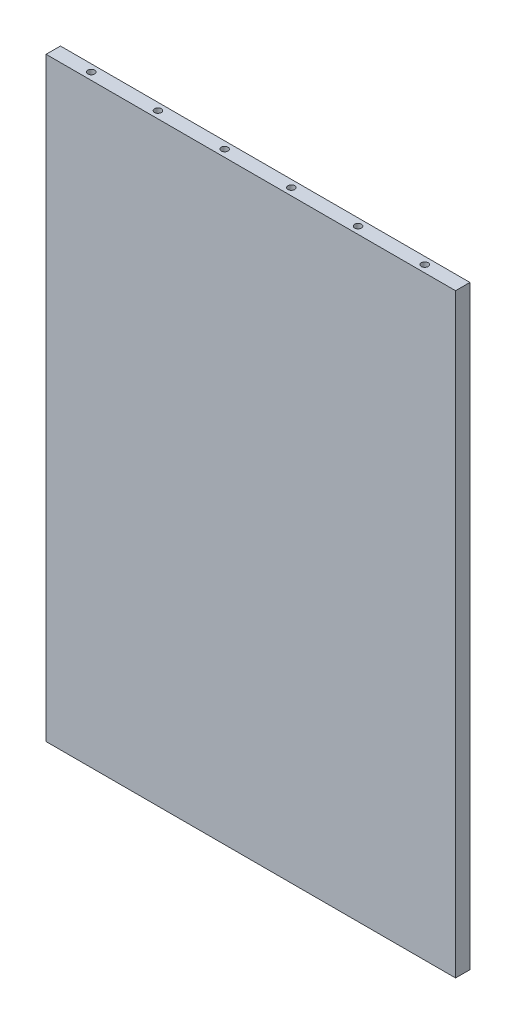
ISO-10303-21;
HEADER;
FILE_DESCRIPTION(('STEP AP214'),'2;1');
FILE_NAME('part.step','',(''),(''),'','','');
FILE_SCHEMA(('AUTOMOTIVE_DESIGN { 1 0 10303 214 1 1 1 1 }'));
ENDSEC;
DATA;
#1=APPLICATION_CONTEXT('core data for automotive mechanical design processes');
#2=APPLICATION_PROTOCOL_DEFINITION('international standard','automotive_design',2000,#1);
#3=PRODUCT_CONTEXT('',#1,'mechanical');
#4=PRODUCT('Part','Part','',(#3));
#5=PRODUCT_RELATED_PRODUCT_CATEGORY('part','',(#4));
#6=PRODUCT_DEFINITION_FORMATION('','',#4);
#7=PRODUCT_DEFINITION_CONTEXT('part definition',#1,'design');
#8=PRODUCT_DEFINITION('design','',#6,#7);
#9=PRODUCT_DEFINITION_SHAPE('','',#8);
#10=(LENGTH_UNIT() NAMED_UNIT(*) SI_UNIT(.MILLI.,.METRE.));
#11=(NAMED_UNIT(*) PLANE_ANGLE_UNIT() SI_UNIT($,.RADIAN.));
#12=(NAMED_UNIT(*) SI_UNIT($,.STERADIAN.) SOLID_ANGLE_UNIT());
#13=UNCERTAINTY_MEASURE_WITH_UNIT(LENGTH_MEASURE(1.E-05),#10,'distance_accuracy_value','');
#14=(GEOMETRIC_REPRESENTATION_CONTEXT(3) GLOBAL_UNCERTAINTY_ASSIGNED_CONTEXT((#13)) GLOBAL_UNIT_ASSIGNED_CONTEXT((#10,
#11,#12)) REPRESENTATION_CONTEXT('',''));
#15=CARTESIAN_POINT('',(0.,0.,0.));
#16=DIRECTION('',(0.,0.,1.));
#17=DIRECTION('',(1.,0.,0.));
#18=AXIS2_PLACEMENT_3D('',#15,#16,#17);
#19=CARTESIAN_POINT('',(255.,-733.,-17.));
#20=DIRECTION('',(0.,-1.,0.));
#21=DIRECTION('',(1.,0.,0.));
#22=AXIS2_PLACEMENT_3D('',#19,#20,#21);
#23=PLANE('',#22);
#24=CARTESIAN_POINT('',(-106.,-733.,-8.50000000000001));
#25=DIRECTION('',(0.,-1.,0.));
#26=DIRECTION('',(1.,0.,0.));
#27=AXIS2_PLACEMENT_3D('',#24,#25,#26);
#28=CIRCLE('',#27,3.99999999999999);
#29=CARTESIAN_POINT('',(-102.,-733.,-8.50000000000001));
#30=VERTEX_POINT('',#29);
#31=EDGE_CURVE('E178',#30,#30,#28,.F.);
#32=ORIENTED_EDGE('',*,*,#31,.T.);
#33=EDGE_LOOP('',(#32));
#34=FACE_BOUND('',#33,.T.);
#35=CARTESIAN_POINT('',(52.,-733.,-8.50000000000001));
#36=DIRECTION('',(0.,-1.,0.));
#37=DIRECTION('',(1.,0.,0.));
#38=AXIS2_PLACEMENT_3D('',#35,#36,#37);
#39=CIRCLE('',#38,3.99999999999999);
#40=CARTESIAN_POINT('',(56.,-733.,-8.50000000000001));
#41=VERTEX_POINT('',#40);
#42=EDGE_CURVE('E171',#41,#41,#39,.F.);
#43=ORIENTED_EDGE('',*,*,#42,.T.);
#44=EDGE_LOOP('',(#43));
#45=FACE_BOUND('',#44,.T.);
#46=CARTESIAN_POINT('',(210.,-733.,-8.50000000000004));
#47=DIRECTION('',(0.,-1.,0.));
#48=DIRECTION('',(1.,0.,0.));
#49=AXIS2_PLACEMENT_3D('',#46,#47,#48);
#50=CIRCLE('',#49,3.99999999999999);
#51=CARTESIAN_POINT('',(214.,-733.,-8.50000000000004));
#52=VERTEX_POINT('',#51);
#53=EDGE_CURVE('E162',#52,#52,#50,.F.);
#54=ORIENTED_EDGE('',*,*,#53,.T.);
#55=EDGE_LOOP('',(#54));
#56=FACE_BOUND('',#55,.T.);
#57=DIRECTION('',(1.,0.,0.));
#58=VECTOR('',#57,1.);
#59=CARTESIAN_POINT('',(255.,-733.,0.));
#60=LINE('',#59,#58);
#61=CARTESIAN_POINT('',(-230.,-733.,0.));
#62=VERTEX_POINT('',#61);
#63=CARTESIAN_POINT('',(255.,-733.,0.));
#64=VERTEX_POINT('',#63);
#65=EDGE_CURVE('E98',#62,#64,#60,.T.);
#66=ORIENTED_EDGE('',*,*,#65,.F.);
#67=DIRECTION('',(0.,0.,1.));
#68=VECTOR('',#67,1.);
#69=CARTESIAN_POINT('',(-230.,-733.,-17.));
#70=LINE('',#69,#68);
#71=CARTESIAN_POINT('',(-230.,-733.,-17.));
#72=VERTEX_POINT('',#71);
#73=EDGE_CURVE('E43',#72,#62,#70,.T.);
#74=ORIENTED_EDGE('',*,*,#73,.F.);
#75=DIRECTION('',(1.,0.,0.));
#76=VECTOR('',#75,1.);
#77=CARTESIAN_POINT('',(255.,-733.,-17.));
#78=LINE('',#77,#76);
#79=CARTESIAN_POINT('',(255.,-733.,-17.));
#80=VERTEX_POINT('',#79);
#81=EDGE_CURVE('E92',#72,#80,#78,.T.);
#82=ORIENTED_EDGE('',*,*,#81,.T.);
#83=DIRECTION('',(0.,0.,1.));
#84=VECTOR('',#83,1.);
#85=CARTESIAN_POINT('',(255.,-733.,-17.));
#86=LINE('',#85,#84);
#87=EDGE_CURVE('E11',#80,#64,#86,.T.);
#88=ORIENTED_EDGE('',*,*,#87,.T.);
#89=EDGE_LOOP('',(#66,#74,#82,#88));
#90=FACE_BOUND('',#89,.T.);
#91=CARTESIAN_POINT('',(131.,-733.,-8.50000000000004));
#92=DIRECTION('',(0.,-1.,0.));
#93=DIRECTION('',(1.,0.,0.));
#94=AXIS2_PLACEMENT_3D('',#91,#92,#93);
#95=CIRCLE('',#94,3.99999999999999);
#96=CARTESIAN_POINT('',(135.,-733.,-8.50000000000004));
#97=VERTEX_POINT('',#96);
#98=EDGE_CURVE('E167',#97,#97,#95,.F.);
#99=ORIENTED_EDGE('',*,*,#98,.T.);
#100=EDGE_LOOP('',(#99));
#101=FACE_BOUND('',#100,.T.);
#102=CARTESIAN_POINT('',(-27.,-733.,-8.50000000000001));
#103=DIRECTION('',(0.,-1.,0.));
#104=DIRECTION('',(1.,0.,0.));
#105=AXIS2_PLACEMENT_3D('',#102,#103,#104);
#106=CIRCLE('',#105,3.99999999999999);
#107=CARTESIAN_POINT('',(-23.,-733.,-8.50000000000001));
#108=VERTEX_POINT('',#107);
#109=EDGE_CURVE('E175',#108,#108,#106,.F.);
#110=ORIENTED_EDGE('',*,*,#109,.T.);
#111=EDGE_LOOP('',(#110));
#112=FACE_BOUND('',#111,.T.);
#113=CARTESIAN_POINT('',(-185.,-733.,-8.49999999999998));
#114=DIRECTION('',(0.,-1.,0.));
#115=DIRECTION('',(1.,0.,0.));
#116=AXIS2_PLACEMENT_3D('',#113,#114,#115);
#117=CIRCLE('',#116,3.99999999999999);
#118=CARTESIAN_POINT('',(-181.,-733.,-8.49999999999998));
#119=VERTEX_POINT('',#118);
#120=EDGE_CURVE('E37',#119,#119,#117,.F.);
#121=ORIENTED_EDGE('',*,*,#120,.T.);
#122=EDGE_LOOP('',(#121));
#123=FACE_BOUND('',#122,.T.);
#124=ADVANCED_FACE('F33',(#34,#45,#56,#90,#101,#112,#123),#23,.T.);
#125=CARTESIAN_POINT('',(0.,0.,-17.));
#126=DIRECTION('',(0.,0.,-1.));
#127=DIRECTION('',(-1.,0.,0.));
#128=AXIS2_PLACEMENT_3D('',#125,#126,#127);
#129=PLANE('',#128);
#130=CARTESIAN_POINT('',(127.,-92.5000000000001,-17.));
#131=DIRECTION('',(0.,0.,-1.));
#132=DIRECTION('',(-1.,0.,0.));
#133=AXIS2_PLACEMENT_3D('',#130,#131,#132);
#134=CIRCLE('',#133,2.49999999999985);
#135=CARTESIAN_POINT('',(124.5,-92.5000000000001,-17.));
#136=VERTEX_POINT('',#135);
#137=EDGE_CURVE('E802',#136,#136,#134,.T.);
#138=ORIENTED_EDGE('',*,*,#137,.F.);
#139=EDGE_LOOP('',(#138));
#140=FACE_BOUND('',#139,.T.);
#141=CARTESIAN_POINT('',(-193.,-92.5000000000001,-17.));
#142=DIRECTION('',(0.,0.,-1.));
#143=DIRECTION('',(-1.,0.,0.));
#144=AXIS2_PLACEMENT_3D('',#141,#142,#143);
#145=CIRCLE('',#144,2.50000000000029);
#146=CARTESIAN_POINT('',(-195.5,-92.5000000000001,-17.));
#147=VERTEX_POINT('',#146);
#148=EDGE_CURVE('E801',#147,#147,#145,.T.);
#149=ORIENTED_EDGE('',*,*,#148,.F.);
#150=EDGE_LOOP('',(#149));
#151=FACE_BOUND('',#150,.T.);
#152=CARTESIAN_POINT('',(127.,-610.,-17.));
#153=DIRECTION('',(0.,0.,-1.));
#154=DIRECTION('',(-1.,0.,0.));
#155=AXIS2_PLACEMENT_3D('',#152,#153,#154);
#156=CIRCLE('',#155,2.5);
#157=CARTESIAN_POINT('',(124.5,-610.,-17.));
#158=VERTEX_POINT('',#157);
#159=EDGE_CURVE('E165',#158,#158,#156,.T.);
#160=ORIENTED_EDGE('',*,*,#159,.F.);
#161=EDGE_LOOP('',(#160));
#162=FACE_BOUND('',#161,.T.);
#163=CARTESIAN_POINT('',(-193.,-610.,-17.));
#164=DIRECTION('',(0.,0.,-1.));
#165=DIRECTION('',(-1.,0.,0.));
#166=AXIS2_PLACEMENT_3D('',#163,#164,#165);
#167=CIRCLE('',#166,2.50000000000032);
#168=CARTESIAN_POINT('',(-195.5,-610.,-17.));
#169=VERTEX_POINT('',#168);
#170=EDGE_CURVE('E203',#169,#169,#167,.T.);
#171=ORIENTED_EDGE('',*,*,#170,.F.);
#172=EDGE_LOOP('',(#171));
#173=FACE_BOUND('',#172,.T.);
#174=CARTESIAN_POINT('',(245.5,-551.,-17.));
#175=DIRECTION('',(0.,0.,-1.));
#176=DIRECTION('',(-1.,0.,0.));
#177=AXIS2_PLACEMENT_3D('',#174,#175,#176);
#178=CIRCLE('',#177,3.99999999999999);
#179=CARTESIAN_POINT('',(241.5,-551.,-17.));
#180=VERTEX_POINT('',#179);
#181=EDGE_CURVE('E154',#180,#180,#178,.F.);
#182=ORIENTED_EDGE('',*,*,#181,.T.);
#183=EDGE_LOOP('',(#182));
#184=FACE_BOUND('',#183,.T.);
#185=CARTESIAN_POINT('',(245.5,-200.,-17.));
#186=DIRECTION('',(0.,0.,-1.));
#187=DIRECTION('',(-1.,0.,0.));
#188=AXIS2_PLACEMENT_3D('',#185,#186,#187);
#189=CIRCLE('',#188,3.99999999999999);
#190=CARTESIAN_POINT('',(241.5,-200.,-17.));
#191=VERTEX_POINT('',#190);
#192=EDGE_CURVE('E146',#191,#191,#189,.F.);
#193=ORIENTED_EDGE('',*,*,#192,.T.);
#194=EDGE_LOOP('',(#193));
#195=FACE_BOUND('',#194,.T.);
#196=CARTESIAN_POINT('',(245.5,-83.,-17.));
#197=DIRECTION('',(0.,0.,-1.));
#198=DIRECTION('',(-1.,0.,0.));
#199=AXIS2_PLACEMENT_3D('',#196,#197,#198);
#200=CIRCLE('',#199,3.99999999999999);
#201=CARTESIAN_POINT('',(241.5,-83.,-17.));
#202=VERTEX_POINT('',#201);
#203=EDGE_CURVE('E137',#202,#202,#200,.F.);
#204=ORIENTED_EDGE('',*,*,#203,.T.);
#205=EDGE_LOOP('',(#204));
#206=FACE_BOUND('',#205,.T.);
#207=CARTESIAN_POINT('',(127.,-262.,-17.));
#208=DIRECTION('',(0.,0.,-1.));
#209=DIRECTION('',(-1.,0.,0.));
#210=AXIS2_PLACEMENT_3D('',#207,#208,#209);
#211=CIRCLE('',#210,2.49999999999985);
#212=CARTESIAN_POINT('',(124.5,-262.,-17.));
#213=VERTEX_POINT('',#212);
#214=EDGE_CURVE('E140',#213,#213,#211,.T.);
#215=ORIENTED_EDGE('',*,*,#214,.F.);
#216=EDGE_LOOP('',(#215));
#217=FACE_BOUND('',#216,.T.);
#218=CARTESIAN_POINT('',(-193.,-262.,-17.));
#219=DIRECTION('',(0.,0.,-1.));
#220=DIRECTION('',(-1.,0.,0.));
#221=AXIS2_PLACEMENT_3D('',#218,#219,#220);
#222=CIRCLE('',#221,2.49999999999985);
#223=CARTESIAN_POINT('',(-195.5,-262.,-17.));
#224=VERTEX_POINT('',#223);
#225=EDGE_CURVE('E226',#224,#224,#222,.T.);
#226=ORIENTED_EDGE('',*,*,#225,.F.);
#227=EDGE_LOOP('',(#226));
#228=FACE_BOUND('',#227,.T.);
#229=CARTESIAN_POINT('',(127.,-441.5,-17.));
#230=DIRECTION('',(0.,0.,-1.));
#231=DIRECTION('',(-1.,0.,0.));
#232=AXIS2_PLACEMENT_3D('',#229,#230,#231);
#233=CIRCLE('',#232,2.49999999999985);
#234=CARTESIAN_POINT('',(124.5,-441.5,-17.));
#235=VERTEX_POINT('',#234);
#236=EDGE_CURVE('E232',#235,#235,#233,.T.);
#237=ORIENTED_EDGE('',*,*,#236,.F.);
#238=EDGE_LOOP('',(#237));
#239=FACE_BOUND('',#238,.T.);
#240=CARTESIAN_POINT('',(-193.,-441.5,-17.));
#241=DIRECTION('',(0.,0.,-1.));
#242=DIRECTION('',(-1.,0.,0.));
#243=AXIS2_PLACEMENT_3D('',#240,#241,#242);
#244=CIRCLE('',#243,2.49999999999985);
#245=CARTESIAN_POINT('',(-195.5,-441.5,-17.));
#246=VERTEX_POINT('',#245);
#247=EDGE_CURVE('E238',#246,#246,#244,.T.);
#248=ORIENTED_EDGE('',*,*,#247,.F.);
#249=EDGE_LOOP('',(#248));
#250=FACE_BOUND('',#249,.T.);
#251=DIRECTION('',(0.,1.,0.));
#252=VECTOR('',#251,1.);
#253=CARTESIAN_POINT('',(255.,-28.,-17.));
#254=LINE('',#253,#252);
#255=CARTESIAN_POINT('',(255.,-28.,-17.));
#256=VERTEX_POINT('',#255);
#257=EDGE_CURVE('E96',#80,#256,#254,.T.);
#258=ORIENTED_EDGE('',*,*,#257,.F.);
#259=ORIENTED_EDGE('',*,*,#81,.F.);
#260=DIRECTION('',(0.,-1.,0.));
#261=VECTOR('',#260,1.);
#262=CARTESIAN_POINT('',(-230.,-28.0000000000001,-17.));
#263=LINE('',#262,#261);
#264=CARTESIAN_POINT('',(-230.,-28.0000000000001,-17.));
#265=VERTEX_POINT('',#264);
#266=EDGE_CURVE('E83',#265,#72,#263,.T.);
#267=ORIENTED_EDGE('',*,*,#266,.F.);
#268=DIRECTION('',(-1.,0.,0.));
#269=VECTOR('',#268,1.);
#270=CARTESIAN_POINT('',(255.,-28.,-17.));
#271=LINE('',#270,#269);
#272=EDGE_CURVE('E91',#256,#265,#271,.T.);
#273=ORIENTED_EDGE('',*,*,#272,.F.);
#274=EDGE_LOOP('',(#258,#259,#267,#273));
#275=FACE_BOUND('',#274,.T.);
#276=CARTESIAN_POINT('',(245.5,-317.,-17.));
#277=DIRECTION('',(0.,0.,-1.));
#278=DIRECTION('',(-1.,0.,0.));
#279=AXIS2_PLACEMENT_3D('',#276,#277,#278);
#280=CIRCLE('',#279,3.99999999999999);
#281=CARTESIAN_POINT('',(241.5,-317.,-17.));
#282=VERTEX_POINT('',#281);
#283=EDGE_CURVE('E142',#282,#282,#280,.F.);
#284=ORIENTED_EDGE('',*,*,#283,.T.);
#285=EDGE_LOOP('',(#284));
#286=FACE_BOUND('',#285,.T.);
#287=CARTESIAN_POINT('',(245.5,-434.,-17.));
#288=DIRECTION('',(0.,0.,-1.));
#289=DIRECTION('',(-1.,0.,0.));
#290=AXIS2_PLACEMENT_3D('',#287,#288,#289);
#291=CIRCLE('',#290,3.99999999999999);
#292=CARTESIAN_POINT('',(241.5,-434.,-17.));
#293=VERTEX_POINT('',#292);
#294=EDGE_CURVE('E150',#293,#293,#291,.F.);
#295=ORIENTED_EDGE('',*,*,#294,.T.);
#296=EDGE_LOOP('',(#295));
#297=FACE_BOUND('',#296,.T.);
#298=CARTESIAN_POINT('',(245.5,-668.,-17.));
#299=DIRECTION('',(0.,0.,-1.));
#300=DIRECTION('',(-1.,0.,0.));
#301=AXIS2_PLACEMENT_3D('',#298,#299,#300);
#302=CIRCLE('',#301,3.99999999999999);
#303=CARTESIAN_POINT('',(241.5,-668.,-17.));
#304=VERTEX_POINT('',#303);
#305=EDGE_CURVE('E158',#304,#304,#302,.F.);
#306=ORIENTED_EDGE('',*,*,#305,.T.);
#307=EDGE_LOOP('',(#306));
#308=FACE_BOUND('',#307,.T.);
#309=ADVANCED_FACE('F89',(#140,#151,#162,#173,#184,#195,#206,#217,#228,#239,#250,#275,#286,#297,
#308),#129,.T.);
#310=CARTESIAN_POINT('',(255.,-28.,-17.));
#311=DIRECTION('',(0.,1.,0.));
#312=DIRECTION('',(-1.,0.,0.));
#313=AXIS2_PLACEMENT_3D('',#310,#311,#312);
#314=PLANE('',#313);
#315=CARTESIAN_POINT('',(-106.,-28.,-8.50000000000001));
#316=DIRECTION('',(0.,1.,0.));
#317=DIRECTION('',(-1.,0.,0.));
#318=AXIS2_PLACEMENT_3D('',#315,#316,#317);
#319=CIRCLE('',#318,3.99999999999999);
#320=CARTESIAN_POINT('',(-110.,-28.,-8.50000000000001));
#321=VERTEX_POINT('',#320);
#322=EDGE_CURVE('E129',#321,#321,#319,.F.);
#323=ORIENTED_EDGE('',*,*,#322,.T.);
#324=EDGE_LOOP('',(#323));
#325=FACE_BOUND('',#324,.T.);
#326=CARTESIAN_POINT('',(52.,-28.,-8.50000000000001));
#327=DIRECTION('',(0.,1.,0.));
#328=DIRECTION('',(-1.,0.,0.));
#329=AXIS2_PLACEMENT_3D('',#326,#327,#328);
#330=CIRCLE('',#329,3.99999999999999);
#331=CARTESIAN_POINT('',(48.,-28.,-8.50000000000001));
#332=VERTEX_POINT('',#331);
#333=EDGE_CURVE('E121',#332,#332,#330,.F.);
#334=ORIENTED_EDGE('',*,*,#333,.T.);
#335=EDGE_LOOP('',(#334));
#336=FACE_BOUND('',#335,.T.);
#337=CARTESIAN_POINT('',(210.,-28.,-8.50000000000001));
#338=DIRECTION('',(0.,1.,0.));
#339=DIRECTION('',(-1.,0.,0.));
#340=AXIS2_PLACEMENT_3D('',#337,#338,#339);
#341=CIRCLE('',#340,3.99999999999999);
#342=CARTESIAN_POINT('',(206.,-28.,-8.50000000000001));
#343=VERTEX_POINT('',#342);
#344=EDGE_CURVE('E107',#343,#343,#341,.F.);
#345=ORIENTED_EDGE('',*,*,#344,.T.);
#346=EDGE_LOOP('',(#345));
#347=FACE_BOUND('',#346,.T.);
#348=DIRECTION('',(-1.,0.,0.));
#349=VECTOR('',#348,1.);
#350=CARTESIAN_POINT('',(255.,-28.,0.));
#351=LINE('',#350,#349);
#352=CARTESIAN_POINT('',(255.,-28.,0.));
#353=VERTEX_POINT('',#352);
#354=CARTESIAN_POINT('',(-230.,-28.0000000000001,0.));
#355=VERTEX_POINT('',#354);
#356=EDGE_CURVE('E106',#353,#355,#351,.T.);
#357=ORIENTED_EDGE('',*,*,#356,.F.);
#358=DIRECTION('',(0.,0.,1.));
#359=VECTOR('',#358,1.);
#360=CARTESIAN_POINT('',(255.,-28.,-17.));
#361=LINE('',#360,#359);
#362=EDGE_CURVE('E77',#256,#353,#361,.T.);
#363=ORIENTED_EDGE('',*,*,#362,.F.);
#364=ORIENTED_EDGE('',*,*,#272,.T.);
#365=DIRECTION('',(0.,0.,1.));
#366=VECTOR('',#365,1.);
#367=CARTESIAN_POINT('',(-230.,-28.0000000000001,-17.));
#368=LINE('',#367,#366);
#369=EDGE_CURVE('E80',#265,#355,#368,.T.);
#370=ORIENTED_EDGE('',*,*,#369,.T.);
#371=EDGE_LOOP('',(#357,#363,#364,#370));
#372=FACE_BOUND('',#371,.T.);
#373=CARTESIAN_POINT('',(131.,-28.,-8.50000000000001));
#374=DIRECTION('',(0.,1.,0.));
#375=DIRECTION('',(-1.,0.,0.));
#376=AXIS2_PLACEMENT_3D('',#373,#374,#375);
#377=CIRCLE('',#376,3.99999999999999);
#378=CARTESIAN_POINT('',(127.,-28.,-8.50000000000001));
#379=VERTEX_POINT('',#378);
#380=EDGE_CURVE('E117',#379,#379,#377,.F.);
#381=ORIENTED_EDGE('',*,*,#380,.T.);
#382=EDGE_LOOP('',(#381));
#383=FACE_BOUND('',#382,.T.);
#384=CARTESIAN_POINT('',(-27.,-28.,-8.50000000000001));
#385=DIRECTION('',(0.,1.,0.));
#386=DIRECTION('',(-1.,0.,0.));
#387=AXIS2_PLACEMENT_3D('',#384,#385,#386);
#388=CIRCLE('',#387,3.99999999999999);
#389=CARTESIAN_POINT('',(-31.,-28.,-8.50000000000001));
#390=VERTEX_POINT('',#389);
#391=EDGE_CURVE('E125',#390,#390,#388,.F.);
#392=ORIENTED_EDGE('',*,*,#391,.T.);
#393=EDGE_LOOP('',(#392));
#394=FACE_BOUND('',#393,.T.);
#395=CARTESIAN_POINT('',(-185.,-28.0000000000001,-8.50000000000001));
#396=DIRECTION('',(0.,1.,0.));
#397=DIRECTION('',(-1.,0.,0.));
#398=AXIS2_PLACEMENT_3D('',#395,#396,#397);
#399=CIRCLE('',#398,3.99999999999999);
#400=CARTESIAN_POINT('',(-189.,-28.0000000000001,-8.50000000000001));
#401=VERTEX_POINT('',#400);
#402=EDGE_CURVE('E133',#401,#401,#399,.F.);
#403=ORIENTED_EDGE('',*,*,#402,.T.);
#404=EDGE_LOOP('',(#403));
#405=FACE_BOUND('',#404,.T.);
#406=ADVANCED_FACE('F94',(#325,#336,#347,#372,#383,#394,#405),#314,.T.);
#407=CARTESIAN_POINT('',(255.,-28.,-17.));
#408=DIRECTION('',(1.,0.,0.));
#409=DIRECTION('',(0.,1.,0.));
#410=AXIS2_PLACEMENT_3D('',#407,#408,#409);
#411=PLANE('',#410);
#412=DIRECTION('',(0.,1.,0.));
#413=VECTOR('',#412,1.);
#414=CARTESIAN_POINT('',(255.,-28.,0.));
#415=LINE('',#414,#413);
#416=EDGE_CURVE('E103',#64,#353,#415,.T.);
#417=ORIENTED_EDGE('',*,*,#416,.F.);
#418=ORIENTED_EDGE('',*,*,#87,.F.);
#419=ORIENTED_EDGE('',*,*,#257,.T.);
#420=ORIENTED_EDGE('',*,*,#362,.T.);
#421=EDGE_LOOP('',(#417,#418,#419,#420));
#422=FACE_BOUND('',#421,.T.);
#423=ADVANCED_FACE('F35',(#422),#411,.T.);
#424=CARTESIAN_POINT('',(-230.,-28.0000000000001,-17.));
#425=DIRECTION('',(-1.,0.,0.));
#426=DIRECTION('',(0.,-1.,0.));
#427=AXIS2_PLACEMENT_3D('',#424,#425,#426);
#428=PLANE('',#427);
#429=DIRECTION('',(0.,-1.,0.));
#430=VECTOR('',#429,1.);
#431=CARTESIAN_POINT('',(-230.,-28.0000000000001,0.));
#432=LINE('',#431,#430);
#433=EDGE_CURVE('E85',#355,#62,#432,.T.);
#434=ORIENTED_EDGE('',*,*,#433,.F.);
#435=ORIENTED_EDGE('',*,*,#369,.F.);
#436=ORIENTED_EDGE('',*,*,#266,.T.);
#437=ORIENTED_EDGE('',*,*,#73,.T.);
#438=EDGE_LOOP('',(#434,#435,#436,#437));
#439=FACE_BOUND('',#438,.T.);
#440=ADVANCED_FACE('F82',(#439),#428,.T.);
#441=CARTESIAN_POINT('',(0.,0.,0.));
#442=DIRECTION('',(0.,0.,-1.));
#443=DIRECTION('',(-1.,0.,0.));
#444=AXIS2_PLACEMENT_3D('',#441,#442,#443);
#445=PLANE('',#444);
#446=ORIENTED_EDGE('',*,*,#416,.T.);
#447=ORIENTED_EDGE('',*,*,#356,.T.);
#448=ORIENTED_EDGE('',*,*,#433,.T.);
#449=ORIENTED_EDGE('',*,*,#65,.T.);
#450=EDGE_LOOP('',(#446,#447,#448,#449));
#451=FACE_BOUND('',#450,.T.);
#452=ADVANCED_FACE('F271',(#451),#445,.F.);
#453=CARTESIAN_POINT('',(210.,-53.,-8.50000000000001));
#454=DIRECTION('',(0.,1.,0.));
#455=DIRECTION('',(0.,0.,1.));
#456=AXIS2_PLACEMENT_3D('',#453,#454,#455);
#457=CYLINDRICAL_SURFACE('',#456,3.99999999999999);
#458=ORIENTED_EDGE('',*,*,#344,.F.);
#459=EDGE_LOOP('',(#458));
#460=FACE_BOUND('',#459,.T.);
#461=CARTESIAN_POINT('',(210.,-53.,-8.50000000000001));
#462=DIRECTION('',(0.,-1.,0.));
#463=DIRECTION('',(0.,0.,-1.));
#464=AXIS2_PLACEMENT_3D('',#461,#462,#463);
#465=CIRCLE('',#464,3.99999999999999);
#466=CARTESIAN_POINT('',(210.,-53.,-12.5));
#467=VERTEX_POINT('',#466);
#468=EDGE_CURVE('E116',#467,#467,#465,.T.);
#469=ORIENTED_EDGE('',*,*,#468,.T.);
#470=EDGE_LOOP('',(#469));
#471=FACE_BOUND('',#470,.T.);
#472=ADVANCED_FACE('F258',(#460,#471),#457,.F.);
#473=CARTESIAN_POINT('',(210.,-53.,-8.50000000000001));
#474=DIRECTION('',(0.,-1.,0.));
#475=DIRECTION('',(0.,0.,-1.));
#476=AXIS2_PLACEMENT_3D('',#473,#474,#475);
#477=PLANE('',#476);
#478=ORIENTED_EDGE('',*,*,#468,.F.);
#479=EDGE_LOOP('',(#478));
#480=FACE_BOUND('',#479,.T.);
#481=ADVANCED_FACE('F260',(#480),#477,.F.);
#482=CARTESIAN_POINT('',(131.,-53.,-8.50000000000001));
#483=DIRECTION('',(0.,1.,0.));
#484=DIRECTION('',(0.,0.,1.));
#485=AXIS2_PLACEMENT_3D('',#482,#483,#484);
#486=CYLINDRICAL_SURFACE('',#485,3.99999999999999);
#487=ORIENTED_EDGE('',*,*,#380,.F.);
#488=EDGE_LOOP('',(#487));
#489=FACE_BOUND('',#488,.T.);
#490=CARTESIAN_POINT('',(131.,-53.,-8.50000000000001));
#491=DIRECTION('',(0.,-1.,0.));
#492=DIRECTION('',(0.,0.,-1.));
#493=AXIS2_PLACEMENT_3D('',#490,#491,#492);
#494=CIRCLE('',#493,3.99999999999999);
#495=CARTESIAN_POINT('',(131.,-53.,-12.5));
#496=VERTEX_POINT('',#495);
#497=EDGE_CURVE('E120',#496,#496,#494,.T.);
#498=ORIENTED_EDGE('',*,*,#497,.T.);
#499=EDGE_LOOP('',(#498));
#500=FACE_BOUND('',#499,.T.);
#501=ADVANCED_FACE('F262',(#489,#500),#486,.F.);
#502=CARTESIAN_POINT('',(131.,-53.,-8.50000000000001));
#503=DIRECTION('',(0.,-1.,0.));
#504=DIRECTION('',(0.,0.,-1.));
#505=AXIS2_PLACEMENT_3D('',#502,#503,#504);
#506=PLANE('',#505);
#507=ORIENTED_EDGE('',*,*,#497,.F.);
#508=EDGE_LOOP('',(#507));
#509=FACE_BOUND('',#508,.T.);
#510=ADVANCED_FACE('F268',(#509),#506,.F.);
#511=CARTESIAN_POINT('',(52.,-53.,-8.50000000000001));
#512=DIRECTION('',(0.,1.,0.));
#513=DIRECTION('',(0.,0.,1.));
#514=AXIS2_PLACEMENT_3D('',#511,#512,#513);
#515=CYLINDRICAL_SURFACE('',#514,3.99999999999999);
#516=ORIENTED_EDGE('',*,*,#333,.F.);
#517=EDGE_LOOP('',(#516));
#518=FACE_BOUND('',#517,.T.);
#519=CARTESIAN_POINT('',(52.,-53.,-8.50000000000001));
#520=DIRECTION('',(0.,-1.,0.));
#521=DIRECTION('',(0.,0.,-1.));
#522=AXIS2_PLACEMENT_3D('',#519,#520,#521);
#523=CIRCLE('',#522,3.99999999999999);
#524=CARTESIAN_POINT('',(52.,-53.,-12.5));
#525=VERTEX_POINT('',#524);
#526=EDGE_CURVE('E124',#525,#525,#523,.T.);
#527=ORIENTED_EDGE('',*,*,#526,.T.);
#528=EDGE_LOOP('',(#527));
#529=FACE_BOUND('',#528,.T.);
#530=ADVANCED_FACE('F296',(#518,#529),#515,.F.);
#531=CARTESIAN_POINT('',(52.,-53.,-8.50000000000001));
#532=DIRECTION('',(0.,-1.,0.));
#533=DIRECTION('',(0.,0.,-1.));
#534=AXIS2_PLACEMENT_3D('',#531,#532,#533);
#535=PLANE('',#534);
#536=ORIENTED_EDGE('',*,*,#526,.F.);
#537=EDGE_LOOP('',(#536));
#538=FACE_BOUND('',#537,.T.);
#539=ADVANCED_FACE('F299',(#538),#535,.F.);
#540=CARTESIAN_POINT('',(-27.,-53.,-8.50000000000001));
#541=DIRECTION('',(0.,1.,0.));
#542=DIRECTION('',(0.,0.,1.));
#543=AXIS2_PLACEMENT_3D('',#540,#541,#542);
#544=CYLINDRICAL_SURFACE('',#543,3.99999999999999);
#545=ORIENTED_EDGE('',*,*,#391,.F.);
#546=EDGE_LOOP('',(#545));
#547=FACE_BOUND('',#546,.T.);
#548=CARTESIAN_POINT('',(-27.,-53.,-8.50000000000001));
#549=DIRECTION('',(0.,-1.,0.));
#550=DIRECTION('',(0.,0.,-1.));
#551=AXIS2_PLACEMENT_3D('',#548,#549,#550);
#552=CIRCLE('',#551,3.99999999999999);
#553=CARTESIAN_POINT('',(-27.,-53.,-12.5));
#554=VERTEX_POINT('',#553);
#555=EDGE_CURVE('E128',#554,#554,#552,.T.);
#556=ORIENTED_EDGE('',*,*,#555,.T.);
#557=EDGE_LOOP('',(#556));
#558=FACE_BOUND('',#557,.T.);
#559=ADVANCED_FACE('F304',(#547,#558),#544,.F.);
#560=CARTESIAN_POINT('',(-27.,-53.,-8.50000000000001));
#561=DIRECTION('',(0.,-1.,0.));
#562=DIRECTION('',(0.,0.,-1.));
#563=AXIS2_PLACEMENT_3D('',#560,#561,#562);
#564=PLANE('',#563);
#565=ORIENTED_EDGE('',*,*,#555,.F.);
#566=EDGE_LOOP('',(#565));
#567=FACE_BOUND('',#566,.T.);
#568=ADVANCED_FACE('F309',(#567),#564,.F.);
#569=CARTESIAN_POINT('',(-106.,-53.,-8.50000000000001));
#570=DIRECTION('',(0.,1.,0.));
#571=DIRECTION('',(0.,0.,1.));
#572=AXIS2_PLACEMENT_3D('',#569,#570,#571);
#573=CYLINDRICAL_SURFACE('',#572,3.99999999999999);
#574=ORIENTED_EDGE('',*,*,#322,.F.);
#575=EDGE_LOOP('',(#574));
#576=FACE_BOUND('',#575,.T.);
#577=CARTESIAN_POINT('',(-106.,-53.,-8.50000000000001));
#578=DIRECTION('',(0.,-1.,0.));
#579=DIRECTION('',(0.,0.,-1.));
#580=AXIS2_PLACEMENT_3D('',#577,#578,#579);
#581=CIRCLE('',#580,3.99999999999999);
#582=CARTESIAN_POINT('',(-106.,-53.,-12.5));
#583=VERTEX_POINT('',#582);
#584=EDGE_CURVE('E132',#583,#583,#581,.T.);
#585=ORIENTED_EDGE('',*,*,#584,.T.);
#586=EDGE_LOOP('',(#585));
#587=FACE_BOUND('',#586,.T.);
#588=ADVANCED_FACE('F345',(#576,#587),#573,.F.);
#589=CARTESIAN_POINT('',(-106.,-53.,-8.50000000000001));
#590=DIRECTION('',(0.,-1.,0.));
#591=DIRECTION('',(0.,0.,-1.));
#592=AXIS2_PLACEMENT_3D('',#589,#590,#591);
#593=PLANE('',#592);
#594=ORIENTED_EDGE('',*,*,#584,.F.);
#595=EDGE_LOOP('',(#594));
#596=FACE_BOUND('',#595,.T.);
#597=ADVANCED_FACE('F354',(#596),#593,.F.);
#598=CARTESIAN_POINT('',(-185.,-53.,-8.50000000000001));
#599=DIRECTION('',(0.,1.,0.));
#600=DIRECTION('',(0.,0.,1.));
#601=AXIS2_PLACEMENT_3D('',#598,#599,#600);
#602=CYLINDRICAL_SURFACE('',#601,3.99999999999999);
#603=ORIENTED_EDGE('',*,*,#402,.F.);
#604=EDGE_LOOP('',(#603));
#605=FACE_BOUND('',#604,.T.);
#606=CARTESIAN_POINT('',(-185.,-53.,-8.50000000000001));
#607=DIRECTION('',(0.,-1.,0.));
#608=DIRECTION('',(0.,0.,-1.));
#609=AXIS2_PLACEMENT_3D('',#606,#607,#608);
#610=CIRCLE('',#609,3.99999999999999);
#611=CARTESIAN_POINT('',(-185.,-53.,-12.5));
#612=VERTEX_POINT('',#611);
#613=EDGE_CURVE('E136',#612,#612,#610,.T.);
#614=ORIENTED_EDGE('',*,*,#613,.T.);
#615=EDGE_LOOP('',(#614));
#616=FACE_BOUND('',#615,.T.);
#617=ADVANCED_FACE('F364',(#605,#616),#602,.F.);
#618=CARTESIAN_POINT('',(-185.,-53.,-8.50000000000001));
#619=DIRECTION('',(0.,-1.,0.));
#620=DIRECTION('',(0.,0.,-1.));
#621=AXIS2_PLACEMENT_3D('',#618,#619,#620);
#622=PLANE('',#621);
#623=ORIENTED_EDGE('',*,*,#613,.F.);
#624=EDGE_LOOP('',(#623));
#625=FACE_BOUND('',#624,.T.);
#626=ADVANCED_FACE('F374',(#625),#622,.F.);
#627=CARTESIAN_POINT('',(-193.,-441.5,-5.));
#628=DIRECTION('',(0.,0.,-1.));
#629=DIRECTION('',(-1.,0.,0.));
#630=AXIS2_PLACEMENT_3D('',#627,#628,#629);
#631=CYLINDRICAL_SURFACE('',#630,2.49999999999985);
#632=CARTESIAN_POINT('',(-193.,-441.5,-5.));
#633=DIRECTION('',(0.,0.,-1.));
#634=DIRECTION('',(-1.,0.,0.));
#635=AXIS2_PLACEMENT_3D('',#632,#633,#634);
#636=CIRCLE('',#635,2.49999999999985);
#637=CARTESIAN_POINT('',(-195.5,-441.5,-5.));
#638=VERTEX_POINT('',#637);
#639=EDGE_CURVE('E241',#638,#638,#636,.T.);
#640=ORIENTED_EDGE('',*,*,#639,.F.);
#641=EDGE_LOOP('',(#640));
#642=FACE_BOUND('',#641,.T.);
#643=ORIENTED_EDGE('',*,*,#247,.T.);
#644=EDGE_LOOP('',(#643));
#645=FACE_BOUND('',#644,.T.);
#646=ADVANCED_FACE('F384',(#642,#645),#631,.F.);
#647=CARTESIAN_POINT('',(-193.,-441.5,-5.));
#648=DIRECTION('',(0.,0.,-1.));
#649=DIRECTION('',(-1.,0.,0.));
#650=AXIS2_PLACEMENT_3D('',#647,#648,#649);
#651=PLANE('',#650);
#652=ORIENTED_EDGE('',*,*,#639,.T.);
#653=EDGE_LOOP('',(#652));
#654=FACE_BOUND('',#653,.T.);
#655=ADVANCED_FACE('F394',(#654),#651,.T.);
#656=CARTESIAN_POINT('',(127.,-441.5,-5.));
#657=DIRECTION('',(0.,0.,-1.));
#658=DIRECTION('',(-1.,0.,0.));
#659=AXIS2_PLACEMENT_3D('',#656,#657,#658);
#660=CYLINDRICAL_SURFACE('',#659,2.49999999999985);
#661=CARTESIAN_POINT('',(127.,-441.5,-5.));
#662=DIRECTION('',(0.,0.,-1.));
#663=DIRECTION('',(-1.,0.,0.));
#664=AXIS2_PLACEMENT_3D('',#661,#662,#663);
#665=CIRCLE('',#664,2.49999999999985);
#666=CARTESIAN_POINT('',(124.5,-441.5,-5.));
#667=VERTEX_POINT('',#666);
#668=EDGE_CURVE('E235',#667,#667,#665,.T.);
#669=ORIENTED_EDGE('',*,*,#668,.F.);
#670=EDGE_LOOP('',(#669));
#671=FACE_BOUND('',#670,.T.);
#672=ORIENTED_EDGE('',*,*,#236,.T.);
#673=EDGE_LOOP('',(#672));
#674=FACE_BOUND('',#673,.T.);
#675=ADVANCED_FACE('F404',(#671,#674),#660,.F.);
#676=CARTESIAN_POINT('',(127.,-441.5,-5.));
#677=DIRECTION('',(0.,0.,-1.));
#678=DIRECTION('',(-1.,0.,0.));
#679=AXIS2_PLACEMENT_3D('',#676,#677,#678);
#680=PLANE('',#679);
#681=ORIENTED_EDGE('',*,*,#668,.T.);
#682=EDGE_LOOP('',(#681));
#683=FACE_BOUND('',#682,.T.);
#684=ADVANCED_FACE('F414',(#683),#680,.T.);
#685=CARTESIAN_POINT('',(-193.,-262.,-5.));
#686=DIRECTION('',(0.,0.,-1.));
#687=DIRECTION('',(-1.,0.,0.));
#688=AXIS2_PLACEMENT_3D('',#685,#686,#687);
#689=CYLINDRICAL_SURFACE('',#688,2.49999999999985);
#690=CARTESIAN_POINT('',(-193.,-262.,-5.));
#691=DIRECTION('',(0.,0.,-1.));
#692=DIRECTION('',(-1.,0.,0.));
#693=AXIS2_PLACEMENT_3D('',#690,#691,#692);
#694=CIRCLE('',#693,2.49999999999985);
#695=CARTESIAN_POINT('',(-195.5,-262.,-5.));
#696=VERTEX_POINT('',#695);
#697=EDGE_CURVE('E229',#696,#696,#694,.T.);
#698=ORIENTED_EDGE('',*,*,#697,.F.);
#699=EDGE_LOOP('',(#698));
#700=FACE_BOUND('',#699,.T.);
#701=ORIENTED_EDGE('',*,*,#225,.T.);
#702=EDGE_LOOP('',(#701));
#703=FACE_BOUND('',#702,.T.);
#704=ADVANCED_FACE('F424',(#700,#703),#689,.F.);
#705=CARTESIAN_POINT('',(-193.,-262.,-5.));
#706=DIRECTION('',(0.,0.,-1.));
#707=DIRECTION('',(-1.,0.,0.));
#708=AXIS2_PLACEMENT_3D('',#705,#706,#707);
#709=PLANE('',#708);
#710=ORIENTED_EDGE('',*,*,#697,.T.);
#711=EDGE_LOOP('',(#710));
#712=FACE_BOUND('',#711,.T.);
#713=ADVANCED_FACE('F434',(#712),#709,.T.);
#714=CARTESIAN_POINT('',(127.,-262.,-5.));
#715=DIRECTION('',(0.,0.,-1.));
#716=DIRECTION('',(-1.,0.,0.));
#717=AXIS2_PLACEMENT_3D('',#714,#715,#716);
#718=CYLINDRICAL_SURFACE('',#717,2.49999999999985);
#719=CARTESIAN_POINT('',(127.,-262.,-5.));
#720=DIRECTION('',(0.,0.,-1.));
#721=DIRECTION('',(-1.,0.,0.));
#722=AXIS2_PLACEMENT_3D('',#719,#720,#721);
#723=CIRCLE('',#722,2.49999999999985);
#724=CARTESIAN_POINT('',(124.5,-262.,-5.));
#725=VERTEX_POINT('',#724);
#726=EDGE_CURVE('E223',#725,#725,#723,.T.);
#727=ORIENTED_EDGE('',*,*,#726,.F.);
#728=EDGE_LOOP('',(#727));
#729=FACE_BOUND('',#728,.T.);
#730=ORIENTED_EDGE('',*,*,#214,.T.);
#731=EDGE_LOOP('',(#730));
#732=FACE_BOUND('',#731,.T.);
#733=ADVANCED_FACE('F444',(#729,#732),#718,.F.);
#734=CARTESIAN_POINT('',(127.,-262.,-5.));
#735=DIRECTION('',(0.,0.,-1.));
#736=DIRECTION('',(-1.,0.,0.));
#737=AXIS2_PLACEMENT_3D('',#734,#735,#736);
#738=PLANE('',#737);
#739=ORIENTED_EDGE('',*,*,#726,.T.);
#740=EDGE_LOOP('',(#739));
#741=FACE_BOUND('',#740,.T.);
#742=ADVANCED_FACE('F454',(#741),#738,.T.);
#743=CARTESIAN_POINT('',(245.5,-83.,-42.));
#744=DIRECTION('',(0.,0.,1.));
#745=DIRECTION('',(1.,0.,0.));
#746=AXIS2_PLACEMENT_3D('',#743,#744,#745);
#747=CYLINDRICAL_SURFACE('',#746,3.99999999999999);
#748=ORIENTED_EDGE('',*,*,#203,.F.);
#749=EDGE_LOOP('',(#748));
#750=FACE_BOUND('',#749,.T.);
#751=CARTESIAN_POINT('',(245.5,-83.,-4.));
#752=DIRECTION('',(0.,0.,-1.));
#753=DIRECTION('',(-1.,0.,0.));
#754=AXIS2_PLACEMENT_3D('',#751,#752,#753);
#755=CIRCLE('',#754,3.99999999999999);
#756=CARTESIAN_POINT('',(241.5,-83.,-4.));
#757=VERTEX_POINT('',#756);
#758=EDGE_CURVE('E141',#757,#757,#755,.T.);
#759=ORIENTED_EDGE('',*,*,#758,.F.);
#760=EDGE_LOOP('',(#759));
#761=FACE_BOUND('',#760,.T.);
#762=ADVANCED_FACE('F464',(#750,#761),#747,.F.);
#763=CARTESIAN_POINT('',(245.5,-83.,-4.));
#764=DIRECTION('',(0.,0.,-1.));
#765=DIRECTION('',(-1.,0.,0.));
#766=AXIS2_PLACEMENT_3D('',#763,#764,#765);
#767=PLANE('',#766);
#768=ORIENTED_EDGE('',*,*,#758,.T.);
#769=EDGE_LOOP('',(#768));
#770=FACE_BOUND('',#769,.T.);
#771=ADVANCED_FACE('F475',(#770),#767,.T.);
#772=CARTESIAN_POINT('',(245.5,-317.,-42.));
#773=DIRECTION('',(0.,0.,1.));
#774=DIRECTION('',(1.,0.,0.));
#775=AXIS2_PLACEMENT_3D('',#772,#773,#774);
#776=CYLINDRICAL_SURFACE('',#775,3.99999999999999);
#777=ORIENTED_EDGE('',*,*,#283,.F.);
#778=EDGE_LOOP('',(#777));
#779=FACE_BOUND('',#778,.T.);
#780=CARTESIAN_POINT('',(245.5,-317.,-4.));
#781=DIRECTION('',(0.,0.,-1.));
#782=DIRECTION('',(-1.,0.,0.));
#783=AXIS2_PLACEMENT_3D('',#780,#781,#782);
#784=CIRCLE('',#783,3.99999999999999);
#785=CARTESIAN_POINT('',(241.5,-317.,-4.));
#786=VERTEX_POINT('',#785);
#787=EDGE_CURVE('E145',#786,#786,#784,.T.);
#788=ORIENTED_EDGE('',*,*,#787,.F.);
#789=EDGE_LOOP('',(#788));
#790=FACE_BOUND('',#789,.T.);
#791=ADVANCED_FACE('F485',(#779,#790),#776,.F.);
#792=CARTESIAN_POINT('',(245.5,-317.,-4.));
#793=DIRECTION('',(0.,0.,-1.));
#794=DIRECTION('',(-1.,0.,0.));
#795=AXIS2_PLACEMENT_3D('',#792,#793,#794);
#796=PLANE('',#795);
#797=ORIENTED_EDGE('',*,*,#787,.T.);
#798=EDGE_LOOP('',(#797));
#799=FACE_BOUND('',#798,.T.);
#800=ADVANCED_FACE('F495',(#799),#796,.T.);
#801=CARTESIAN_POINT('',(245.5,-200.,-42.));
#802=DIRECTION('',(0.,0.,1.));
#803=DIRECTION('',(1.,0.,0.));
#804=AXIS2_PLACEMENT_3D('',#801,#802,#803);
#805=CYLINDRICAL_SURFACE('',#804,3.99999999999999);
#806=ORIENTED_EDGE('',*,*,#192,.F.);
#807=EDGE_LOOP('',(#806));
#808=FACE_BOUND('',#807,.T.);
#809=CARTESIAN_POINT('',(245.5,-200.,-4.));
#810=DIRECTION('',(0.,0.,-1.));
#811=DIRECTION('',(-1.,0.,0.));
#812=AXIS2_PLACEMENT_3D('',#809,#810,#811);
#813=CIRCLE('',#812,3.99999999999999);
#814=CARTESIAN_POINT('',(241.5,-200.,-4.));
#815=VERTEX_POINT('',#814);
#816=EDGE_CURVE('E149',#815,#815,#813,.T.);
#817=ORIENTED_EDGE('',*,*,#816,.F.);
#818=EDGE_LOOP('',(#817));
#819=FACE_BOUND('',#818,.T.);
#820=ADVANCED_FACE('F505',(#808,#819),#805,.F.);
#821=CARTESIAN_POINT('',(245.5,-200.,-4.));
#822=DIRECTION('',(0.,0.,-1.));
#823=DIRECTION('',(-1.,0.,0.));
#824=AXIS2_PLACEMENT_3D('',#821,#822,#823);
#825=PLANE('',#824);
#826=ORIENTED_EDGE('',*,*,#816,.T.);
#827=EDGE_LOOP('',(#826));
#828=FACE_BOUND('',#827,.T.);
#829=ADVANCED_FACE('F515',(#828),#825,.T.);
#830=CARTESIAN_POINT('',(245.5,-434.,-42.));
#831=DIRECTION('',(0.,0.,1.));
#832=DIRECTION('',(1.,0.,0.));
#833=AXIS2_PLACEMENT_3D('',#830,#831,#832);
#834=CYLINDRICAL_SURFACE('',#833,3.99999999999999);
#835=ORIENTED_EDGE('',*,*,#294,.F.);
#836=EDGE_LOOP('',(#835));
#837=FACE_BOUND('',#836,.T.);
#838=CARTESIAN_POINT('',(245.5,-434.,-4.));
#839=DIRECTION('',(0.,0.,-1.));
#840=DIRECTION('',(-1.,0.,0.));
#841=AXIS2_PLACEMENT_3D('',#838,#839,#840);
#842=CIRCLE('',#841,3.99999999999999);
#843=CARTESIAN_POINT('',(241.5,-434.,-4.));
#844=VERTEX_POINT('',#843);
#845=EDGE_CURVE('E153',#844,#844,#842,.T.);
#846=ORIENTED_EDGE('',*,*,#845,.F.);
#847=EDGE_LOOP('',(#846));
#848=FACE_BOUND('',#847,.T.);
#849=ADVANCED_FACE('F525',(#837,#848),#834,.F.);
#850=CARTESIAN_POINT('',(245.5,-434.,-4.));
#851=DIRECTION('',(0.,0.,-1.));
#852=DIRECTION('',(-1.,0.,0.));
#853=AXIS2_PLACEMENT_3D('',#850,#851,#852);
#854=PLANE('',#853);
#855=ORIENTED_EDGE('',*,*,#845,.T.);
#856=EDGE_LOOP('',(#855));
#857=FACE_BOUND('',#856,.T.);
#858=ADVANCED_FACE('F535',(#857),#854,.T.);
#859=CARTESIAN_POINT('',(245.5,-551.,-42.));
#860=DIRECTION('',(0.,0.,1.));
#861=DIRECTION('',(1.,0.,0.));
#862=AXIS2_PLACEMENT_3D('',#859,#860,#861);
#863=CYLINDRICAL_SURFACE('',#862,3.99999999999999);
#864=ORIENTED_EDGE('',*,*,#181,.F.);
#865=EDGE_LOOP('',(#864));
#866=FACE_BOUND('',#865,.T.);
#867=CARTESIAN_POINT('',(245.5,-551.,-4.));
#868=DIRECTION('',(0.,0.,-1.));
#869=DIRECTION('',(-1.,0.,0.));
#870=AXIS2_PLACEMENT_3D('',#867,#868,#869);
#871=CIRCLE('',#870,3.99999999999999);
#872=CARTESIAN_POINT('',(241.5,-551.,-4.));
#873=VERTEX_POINT('',#872);
#874=EDGE_CURVE('E157',#873,#873,#871,.T.);
#875=ORIENTED_EDGE('',*,*,#874,.F.);
#876=EDGE_LOOP('',(#875));
#877=FACE_BOUND('',#876,.T.);
#878=ADVANCED_FACE('F545',(#866,#877),#863,.F.);
#879=CARTESIAN_POINT('',(245.5,-551.,-4.));
#880=DIRECTION('',(0.,0.,-1.));
#881=DIRECTION('',(-1.,0.,0.));
#882=AXIS2_PLACEMENT_3D('',#879,#880,#881);
#883=PLANE('',#882);
#884=ORIENTED_EDGE('',*,*,#874,.T.);
#885=EDGE_LOOP('',(#884));
#886=FACE_BOUND('',#885,.T.);
#887=ADVANCED_FACE('F555',(#886),#883,.T.);
#888=CARTESIAN_POINT('',(245.5,-668.,-42.));
#889=DIRECTION('',(0.,0.,1.));
#890=DIRECTION('',(1.,0.,0.));
#891=AXIS2_PLACEMENT_3D('',#888,#889,#890);
#892=CYLINDRICAL_SURFACE('',#891,3.99999999999999);
#893=ORIENTED_EDGE('',*,*,#305,.F.);
#894=EDGE_LOOP('',(#893));
#895=FACE_BOUND('',#894,.T.);
#896=CARTESIAN_POINT('',(245.5,-668.,-4.));
#897=DIRECTION('',(0.,0.,-1.));
#898=DIRECTION('',(-1.,0.,0.));
#899=AXIS2_PLACEMENT_3D('',#896,#897,#898);
#900=CIRCLE('',#899,3.99999999999999);
#901=CARTESIAN_POINT('',(241.5,-668.,-4.));
#902=VERTEX_POINT('',#901);
#903=EDGE_CURVE('E161',#902,#902,#900,.T.);
#904=ORIENTED_EDGE('',*,*,#903,.F.);
#905=EDGE_LOOP('',(#904));
#906=FACE_BOUND('',#905,.T.);
#907=ADVANCED_FACE('F565',(#895,#906),#892,.F.);
#908=CARTESIAN_POINT('',(245.5,-668.,-4.));
#909=DIRECTION('',(0.,0.,-1.));
#910=DIRECTION('',(-1.,0.,0.));
#911=AXIS2_PLACEMENT_3D('',#908,#909,#910);
#912=PLANE('',#911);
#913=ORIENTED_EDGE('',*,*,#903,.T.);
#914=EDGE_LOOP('',(#913));
#915=FACE_BOUND('',#914,.T.);
#916=ADVANCED_FACE('F575',(#915),#912,.T.);
#917=CARTESIAN_POINT('',(-193.,-610.,-5.));
#918=DIRECTION('',(0.,0.,-1.));
#919=DIRECTION('',(-1.,0.,0.));
#920=AXIS2_PLACEMENT_3D('',#917,#918,#919);
#921=CYLINDRICAL_SURFACE('',#920,2.50000000000032);
#922=CARTESIAN_POINT('',(-193.,-610.,-5.));
#923=DIRECTION('',(0.,0.,-1.));
#924=DIRECTION('',(-1.,0.,0.));
#925=AXIS2_PLACEMENT_3D('',#922,#923,#924);
#926=CIRCLE('',#925,2.50000000000032);
#927=CARTESIAN_POINT('',(-195.5,-610.,-5.));
#928=VERTEX_POINT('',#927);
#929=EDGE_CURVE('E206',#928,#928,#926,.T.);
#930=ORIENTED_EDGE('',*,*,#929,.F.);
#931=EDGE_LOOP('',(#930));
#932=FACE_BOUND('',#931,.T.);
#933=ORIENTED_EDGE('',*,*,#170,.T.);
#934=EDGE_LOOP('',(#933));
#935=FACE_BOUND('',#934,.T.);
#936=ADVANCED_FACE('F585',(#932,#935),#921,.F.);
#937=CARTESIAN_POINT('',(-193.,-610.,-5.));
#938=DIRECTION('',(0.,0.,-1.));
#939=DIRECTION('',(-1.,0.,0.));
#940=AXIS2_PLACEMENT_3D('',#937,#938,#939);
#941=PLANE('',#940);
#942=ORIENTED_EDGE('',*,*,#929,.T.);
#943=EDGE_LOOP('',(#942));
#944=FACE_BOUND('',#943,.T.);
#945=ADVANCED_FACE('F595',(#944),#941,.T.);
#946=CARTESIAN_POINT('',(127.,-610.,-5.));
#947=DIRECTION('',(0.,0.,-1.));
#948=DIRECTION('',(-1.,0.,0.));
#949=AXIS2_PLACEMENT_3D('',#946,#947,#948);
#950=CYLINDRICAL_SURFACE('',#949,2.5);
#951=CARTESIAN_POINT('',(127.,-610.,-5.));
#952=DIRECTION('',(0.,0.,-1.));
#953=DIRECTION('',(-1.,0.,0.));
#954=AXIS2_PLACEMENT_3D('',#951,#952,#953);
#955=CIRCLE('',#954,2.5);
#956=CARTESIAN_POINT('',(124.5,-610.,-5.));
#957=VERTEX_POINT('',#956);
#958=EDGE_CURVE('E200',#957,#957,#955,.T.);
#959=ORIENTED_EDGE('',*,*,#958,.F.);
#960=EDGE_LOOP('',(#959));
#961=FACE_BOUND('',#960,.T.);
#962=ORIENTED_EDGE('',*,*,#159,.T.);
#963=EDGE_LOOP('',(#962));
#964=FACE_BOUND('',#963,.T.);
#965=ADVANCED_FACE('F605',(#961,#964),#950,.F.);
#966=CARTESIAN_POINT('',(127.,-610.,-5.));
#967=DIRECTION('',(0.,0.,-1.));
#968=DIRECTION('',(-1.,0.,0.));
#969=AXIS2_PLACEMENT_3D('',#966,#967,#968);
#970=PLANE('',#969);
#971=ORIENTED_EDGE('',*,*,#958,.T.);
#972=EDGE_LOOP('',(#971));
#973=FACE_BOUND('',#972,.T.);
#974=ADVANCED_FACE('F615',(#973),#970,.T.);
#975=CARTESIAN_POINT('',(210.,-708.,-8.50000000000004));
#976=DIRECTION('',(0.,-1.,0.));
#977=DIRECTION('',(0.,0.,-1.));
#978=AXIS2_PLACEMENT_3D('',#975,#976,#977);
#979=CYLINDRICAL_SURFACE('',#978,3.99999999999999);
#980=ORIENTED_EDGE('',*,*,#53,.F.);
#981=EDGE_LOOP('',(#980));
#982=FACE_BOUND('',#981,.T.);
#983=CARTESIAN_POINT('',(210.,-708.,-8.50000000000004));
#984=DIRECTION('',(0.,1.,0.));
#985=DIRECTION('',(0.,0.,1.));
#986=AXIS2_PLACEMENT_3D('',#983,#984,#985);
#987=CIRCLE('',#986,3.99999999999999);
#988=CARTESIAN_POINT('',(210.,-708.,-4.50000000000004));
#989=VERTEX_POINT('',#988);
#990=EDGE_CURVE('E166',#989,#989,#987,.T.);
#991=ORIENTED_EDGE('',*,*,#990,.T.);
#992=EDGE_LOOP('',(#991));
#993=FACE_BOUND('',#992,.T.);
#994=ADVANCED_FACE('F624',(#982,#993),#979,.F.);
#995=CARTESIAN_POINT('',(210.,-708.,-8.50000000000004));
#996=DIRECTION('',(0.,1.,0.));
#997=DIRECTION('',(0.,0.,1.));
#998=AXIS2_PLACEMENT_3D('',#995,#996,#997);
#999=PLANE('',#998);
#1000=ORIENTED_EDGE('',*,*,#990,.F.);
#1001=EDGE_LOOP('',(#1000));
#1002=FACE_BOUND('',#1001,.T.);
#1003=ADVANCED_FACE('F639',(#1002),#999,.F.);
#1004=CARTESIAN_POINT('',(131.,-708.,-8.50000000000004));
#1005=DIRECTION('',(0.,-1.,0.));
#1006=DIRECTION('',(0.,0.,-1.));
#1007=AXIS2_PLACEMENT_3D('',#1004,#1005,#1006);
#1008=CYLINDRICAL_SURFACE('',#1007,3.99999999999999);
#1009=ORIENTED_EDGE('',*,*,#98,.F.);
#1010=EDGE_LOOP('',(#1009));
#1011=FACE_BOUND('',#1010,.T.);
#1012=CARTESIAN_POINT('',(131.,-708.,-8.50000000000004));
#1013=DIRECTION('',(0.,1.,0.));
#1014=DIRECTION('',(0.,0.,1.));
#1015=AXIS2_PLACEMENT_3D('',#1012,#1013,#1014);
#1016=CIRCLE('',#1015,3.99999999999999);
#1017=CARTESIAN_POINT('',(131.,-708.,-4.50000000000004));
#1018=VERTEX_POINT('',#1017);
#1019=EDGE_CURVE('E170',#1018,#1018,#1016,.T.);
#1020=ORIENTED_EDGE('',*,*,#1019,.T.);
#1021=EDGE_LOOP('',(#1020));
#1022=FACE_BOUND('',#1021,.T.);
#1023=ADVANCED_FACE('F649',(#1011,#1022),#1008,.F.);
#1024=CARTESIAN_POINT('',(131.,-708.,-8.50000000000004));
#1025=DIRECTION('',(0.,1.,0.));
#1026=DIRECTION('',(0.,0.,1.));
#1027=AXIS2_PLACEMENT_3D('',#1024,#1025,#1026);
#1028=PLANE('',#1027);
#1029=ORIENTED_EDGE('',*,*,#1019,.F.);
#1030=EDGE_LOOP('',(#1029));
#1031=FACE_BOUND('',#1030,.T.);
#1032=ADVANCED_FACE('F659',(#1031),#1028,.F.);
#1033=CARTESIAN_POINT('',(52.,-708.,-8.50000000000001));
#1034=DIRECTION('',(0.,-1.,0.));
#1035=DIRECTION('',(0.,0.,-1.));
#1036=AXIS2_PLACEMENT_3D('',#1033,#1034,#1035);
#1037=CYLINDRICAL_SURFACE('',#1036,3.99999999999999);
#1038=ORIENTED_EDGE('',*,*,#42,.F.);
#1039=EDGE_LOOP('',(#1038));
#1040=FACE_BOUND('',#1039,.T.);
#1041=CARTESIAN_POINT('',(52.,-708.,-8.50000000000001));
#1042=DIRECTION('',(0.,1.,0.));
#1043=DIRECTION('',(0.,0.,1.));
#1044=AXIS2_PLACEMENT_3D('',#1041,#1042,#1043);
#1045=CIRCLE('',#1044,3.99999999999999);
#1046=CARTESIAN_POINT('',(52.,-708.,-4.50000000000001));
#1047=VERTEX_POINT('',#1046);
#1048=EDGE_CURVE('E174',#1047,#1047,#1045,.T.);
#1049=ORIENTED_EDGE('',*,*,#1048,.T.);
#1050=EDGE_LOOP('',(#1049));
#1051=FACE_BOUND('',#1050,.T.);
#1052=ADVANCED_FACE('F669',(#1040,#1051),#1037,.F.);
#1053=CARTESIAN_POINT('',(52.,-708.,-8.50000000000001));
#1054=DIRECTION('',(0.,1.,0.));
#1055=DIRECTION('',(0.,0.,1.));
#1056=AXIS2_PLACEMENT_3D('',#1053,#1054,#1055);
#1057=PLANE('',#1056);
#1058=ORIENTED_EDGE('',*,*,#1048,.F.);
#1059=EDGE_LOOP('',(#1058));
#1060=FACE_BOUND('',#1059,.T.);
#1061=ADVANCED_FACE('F679',(#1060),#1057,.F.);
#1062=CARTESIAN_POINT('',(-27.,-708.,-8.50000000000001));
#1063=DIRECTION('',(0.,-1.,0.));
#1064=DIRECTION('',(0.,0.,-1.));
#1065=AXIS2_PLACEMENT_3D('',#1062,#1063,#1064);
#1066=CYLINDRICAL_SURFACE('',#1065,3.99999999999999);
#1067=ORIENTED_EDGE('',*,*,#109,.F.);
#1068=EDGE_LOOP('',(#1067));
#1069=FACE_BOUND('',#1068,.T.);
#1070=CARTESIAN_POINT('',(-27.,-708.,-8.50000000000001));
#1071=DIRECTION('',(0.,1.,0.));
#1072=DIRECTION('',(0.,0.,1.));
#1073=AXIS2_PLACEMENT_3D('',#1070,#1071,#1072);
#1074=CIRCLE('',#1073,3.99999999999999);
#1075=CARTESIAN_POINT('',(-27.,-708.,-4.50000000000002));
#1076=VERTEX_POINT('',#1075);
#1077=EDGE_CURVE('E177',#1076,#1076,#1074,.T.);
#1078=ORIENTED_EDGE('',*,*,#1077,.T.);
#1079=EDGE_LOOP('',(#1078));
#1080=FACE_BOUND('',#1079,.T.);
#1081=ADVANCED_FACE('F689',(#1069,#1080),#1066,.F.);
#1082=CARTESIAN_POINT('',(-27.,-708.,-8.50000000000001));
#1083=DIRECTION('',(0.,1.,0.));
#1084=DIRECTION('',(0.,0.,1.));
#1085=AXIS2_PLACEMENT_3D('',#1082,#1083,#1084);
#1086=PLANE('',#1085);
#1087=ORIENTED_EDGE('',*,*,#1077,.F.);
#1088=EDGE_LOOP('',(#1087));
#1089=FACE_BOUND('',#1088,.T.);
#1090=ADVANCED_FACE('F699',(#1089),#1086,.F.);
#1091=CARTESIAN_POINT('',(-106.,-708.,-8.50000000000001));
#1092=DIRECTION('',(0.,-1.,0.));
#1093=DIRECTION('',(0.,0.,-1.));
#1094=AXIS2_PLACEMENT_3D('',#1091,#1092,#1093);
#1095=CYLINDRICAL_SURFACE('',#1094,3.99999999999999);
#1096=ORIENTED_EDGE('',*,*,#31,.F.);
#1097=EDGE_LOOP('',(#1096));
#1098=FACE_BOUND('',#1097,.T.);
#1099=CARTESIAN_POINT('',(-106.,-708.,-8.50000000000001));
#1100=DIRECTION('',(0.,1.,0.));
#1101=DIRECTION('',(0.,0.,1.));
#1102=AXIS2_PLACEMENT_3D('',#1099,#1100,#1101);
#1103=CIRCLE('',#1102,3.99999999999999);
#1104=CARTESIAN_POINT('',(-106.,-708.,-4.50000000000001));
#1105=VERTEX_POINT('',#1104);
#1106=EDGE_CURVE('E180',#1105,#1105,#1103,.T.);
#1107=ORIENTED_EDGE('',*,*,#1106,.T.);
#1108=EDGE_LOOP('',(#1107));
#1109=FACE_BOUND('',#1108,.T.);
#1110=ADVANCED_FACE('F709',(#1098,#1109),#1095,.F.);
#1111=CARTESIAN_POINT('',(-106.,-708.,-8.50000000000001));
#1112=DIRECTION('',(0.,1.,0.));
#1113=DIRECTION('',(0.,0.,1.));
#1114=AXIS2_PLACEMENT_3D('',#1111,#1112,#1113);
#1115=PLANE('',#1114);
#1116=ORIENTED_EDGE('',*,*,#1106,.F.);
#1117=EDGE_LOOP('',(#1116));
#1118=FACE_BOUND('',#1117,.T.);
#1119=ADVANCED_FACE('F719',(#1118),#1115,.F.);
#1120=CARTESIAN_POINT('',(-185.,-708.,-8.49999999999998));
#1121=DIRECTION('',(0.,-1.,0.));
#1122=DIRECTION('',(0.,0.,-1.));
#1123=AXIS2_PLACEMENT_3D('',#1120,#1121,#1122);
#1124=CYLINDRICAL_SURFACE('',#1123,3.99999999999999);
#1125=ORIENTED_EDGE('',*,*,#120,.F.);
#1126=EDGE_LOOP('',(#1125));
#1127=FACE_BOUND('',#1126,.T.);
#1128=CARTESIAN_POINT('',(-185.,-708.,-8.49999999999998));
#1129=DIRECTION('',(0.,1.,0.));
#1130=DIRECTION('',(0.,0.,1.));
#1131=AXIS2_PLACEMENT_3D('',#1128,#1129,#1130);
#1132=CIRCLE('',#1131,3.99999999999999);
#1133=CARTESIAN_POINT('',(-185.,-708.,-4.49999999999999));
#1134=VERTEX_POINT('',#1133);
#1135=EDGE_CURVE('E190',#1134,#1134,#1132,.T.);
#1136=ORIENTED_EDGE('',*,*,#1135,.T.);
#1137=EDGE_LOOP('',(#1136));
#1138=FACE_BOUND('',#1137,.T.);
#1139=ADVANCED_FACE('F729',(#1127,#1138),#1124,.F.);
#1140=CARTESIAN_POINT('',(-185.,-708.,-8.49999999999998));
#1141=DIRECTION('',(0.,1.,0.));
#1142=DIRECTION('',(0.,0.,1.));
#1143=AXIS2_PLACEMENT_3D('',#1140,#1141,#1142);
#1144=PLANE('',#1143);
#1145=ORIENTED_EDGE('',*,*,#1135,.F.);
#1146=EDGE_LOOP('',(#1145));
#1147=FACE_BOUND('',#1146,.T.);
#1148=ADVANCED_FACE('F739',(#1147),#1144,.F.);
#1149=CARTESIAN_POINT('',(-193.,-92.5000000000001,-5.));
#1150=DIRECTION('',(0.,0.,-1.));
#1151=DIRECTION('',(-1.,0.,0.));
#1152=AXIS2_PLACEMENT_3D('',#1149,#1150,#1151);
#1153=CYLINDRICAL_SURFACE('',#1152,2.50000000000029);
#1154=CARTESIAN_POINT('',(-193.,-92.5000000000001,-5.));
#1155=DIRECTION('',(0.,0.,-1.));
#1156=DIRECTION('',(-1.,0.,0.));
#1157=AXIS2_PLACEMENT_3D('',#1154,#1155,#1156);
#1158=CIRCLE('',#1157,2.50000000000029);
#1159=CARTESIAN_POINT('',(-195.5,-92.5000000000001,-5.));
#1160=VERTEX_POINT('',#1159);
#1161=EDGE_CURVE('E805',#1160,#1160,#1158,.T.);
#1162=ORIENTED_EDGE('',*,*,#1161,.F.);
#1163=EDGE_LOOP('',(#1162));
#1164=FACE_BOUND('',#1163,.T.);
#1165=ORIENTED_EDGE('',*,*,#148,.T.);
#1166=EDGE_LOOP('',(#1165));
#1167=FACE_BOUND('',#1166,.T.);
#1168=ADVANCED_FACE('F749',(#1164,#1167),#1153,.F.);
#1169=CARTESIAN_POINT('',(-193.,-92.5000000000001,-5.));
#1170=DIRECTION('',(0.,0.,-1.));
#1171=DIRECTION('',(-1.,0.,0.));
#1172=AXIS2_PLACEMENT_3D('',#1169,#1170,#1171);
#1173=PLANE('',#1172);
#1174=ORIENTED_EDGE('',*,*,#1161,.T.);
#1175=EDGE_LOOP('',(#1174));
#1176=FACE_BOUND('',#1175,.T.);
#1177=ADVANCED_FACE('F764',(#1176),#1173,.T.);
#1178=CARTESIAN_POINT('',(127.,-92.5000000000001,-5.));
#1179=DIRECTION('',(0.,0.,-1.));
#1180=DIRECTION('',(-1.,0.,0.));
#1181=AXIS2_PLACEMENT_3D('',#1178,#1179,#1180);
#1182=CYLINDRICAL_SURFACE('',#1181,2.49999999999985);
#1183=CARTESIAN_POINT('',(127.,-92.5000000000001,-5.));
#1184=DIRECTION('',(0.,0.,-1.));
#1185=DIRECTION('',(-1.,0.,0.));
#1186=AXIS2_PLACEMENT_3D('',#1183,#1184,#1185);
#1187=CIRCLE('',#1186,2.49999999999985);
#1188=CARTESIAN_POINT('',(124.5,-92.5000000000001,-5.));
#1189=VERTEX_POINT('',#1188);
#1190=EDGE_CURVE('E800',#1189,#1189,#1187,.T.);
#1191=ORIENTED_EDGE('',*,*,#1190,.F.);
#1192=EDGE_LOOP('',(#1191));
#1193=FACE_BOUND('',#1192,.T.);
#1194=ORIENTED_EDGE('',*,*,#137,.T.);
#1195=EDGE_LOOP('',(#1194));
#1196=FACE_BOUND('',#1195,.T.);
#1197=ADVANCED_FACE('F774',(#1193,#1196),#1182,.F.);
#1198=CARTESIAN_POINT('',(127.,-92.5000000000001,-5.));
#1199=DIRECTION('',(0.,0.,-1.));
#1200=DIRECTION('',(-1.,0.,0.));
#1201=AXIS2_PLACEMENT_3D('',#1198,#1199,#1200);
#1202=PLANE('',#1201);
#1203=ORIENTED_EDGE('',*,*,#1190,.T.);
#1204=EDGE_LOOP('',(#1203));
#1205=FACE_BOUND('',#1204,.T.);
#1206=ADVANCED_FACE('F784',(#1205),#1202,.T.);
#1207=CLOSED_SHELL('',(#124,#309,#406,#423,#440,#452,#472,#481,#501,#510,#530,#539,#559,#568,
#588,#597,#617,#626,#646,#655,#675,#684,#704,#713,#733,#742,#762,#771,#791,#800,#820,#829,#849,
#858,#878,#887,#907,#916,#936,#945,#965,#974,#994,#1003,#1023,#1032,#1052,#1061,#1081,#1090,
#1110,#1119,#1139,#1148,#1168,#1177,#1197,#1206));
#1208=MANIFOLD_SOLID_BREP('B2',#1207);
#1209=ADVANCED_BREP_SHAPE_REPRESENTATION('',(#18,#1208),#14);
#1210=SHAPE_DEFINITION_REPRESENTATION(#9,#1209);
ENDSEC;
END-ISO-10303-21;
